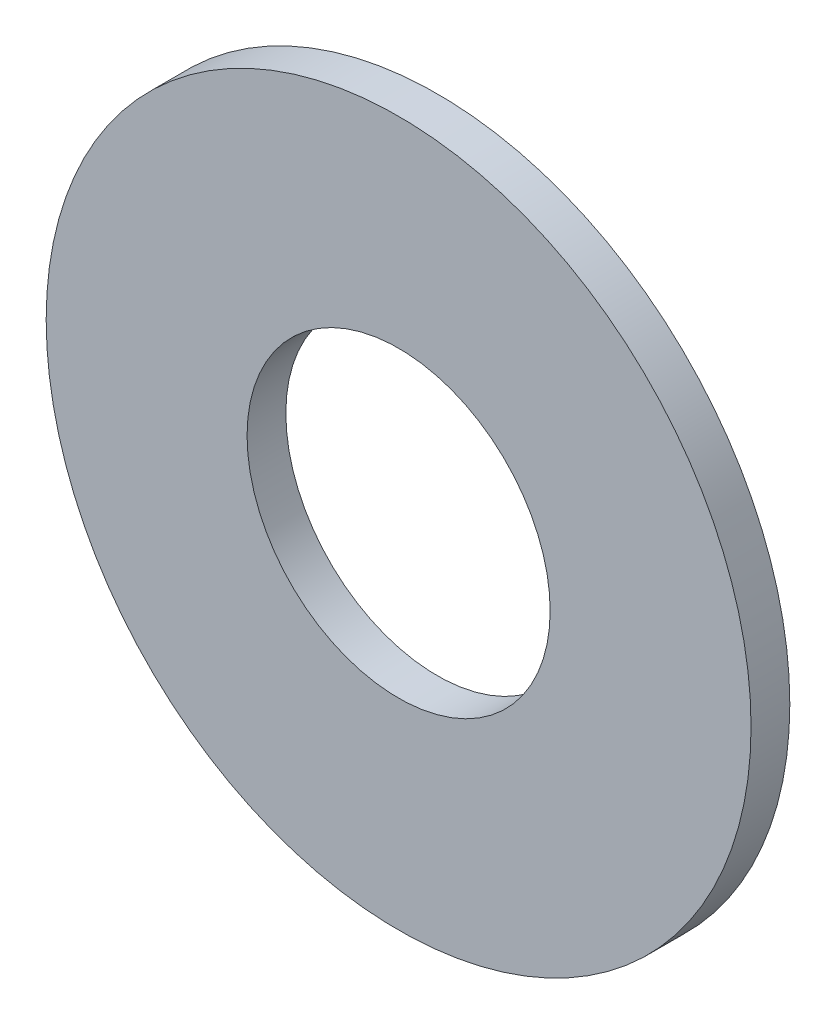
ISO-10303-21;
HEADER;
FILE_DESCRIPTION(('STEP AP214'),'2;1');
FILE_NAME('part.step','',(''),(''),'','','');
FILE_SCHEMA(('AUTOMOTIVE_DESIGN { 1 0 10303 214 1 1 1 1 }'));
ENDSEC;
DATA;
#1=APPLICATION_CONTEXT('core data for automotive mechanical design processes');
#2=APPLICATION_PROTOCOL_DEFINITION('international standard','automotive_design',2000,#1);
#3=PRODUCT_CONTEXT('',#1,'mechanical');
#4=PRODUCT('Part','Part','',(#3));
#5=PRODUCT_RELATED_PRODUCT_CATEGORY('part','',(#4));
#6=PRODUCT_DEFINITION_FORMATION('','',#4);
#7=PRODUCT_DEFINITION_CONTEXT('part definition',#1,'design');
#8=PRODUCT_DEFINITION('design','',#6,#7);
#9=PRODUCT_DEFINITION_SHAPE('','',#8);
#10=(LENGTH_UNIT() NAMED_UNIT(*) SI_UNIT(.MILLI.,.METRE.));
#11=(NAMED_UNIT(*) PLANE_ANGLE_UNIT() SI_UNIT($,.RADIAN.));
#12=(NAMED_UNIT(*) SI_UNIT($,.STERADIAN.) SOLID_ANGLE_UNIT());
#13=UNCERTAINTY_MEASURE_WITH_UNIT(LENGTH_MEASURE(1.E-05),#10,'distance_accuracy_value','');
#14=(GEOMETRIC_REPRESENTATION_CONTEXT(3) GLOBAL_UNCERTAINTY_ASSIGNED_CONTEXT((#13)) GLOBAL_UNIT_ASSIGNED_CONTEXT((#10,
#11,#12)) REPRESENTATION_CONTEXT('',''));
#15=CARTESIAN_POINT('',(0.,0.,0.));
#16=DIRECTION('',(0.,0.,1.));
#17=DIRECTION('',(1.,0.,0.));
#18=AXIS2_PLACEMENT_3D('',#15,#16,#17);
#19=CARTESIAN_POINT('',(0.,0.,1.397));
#20=DIRECTION('',(0.,0.,1.));
#21=DIRECTION('',(1.,0.,0.));
#22=AXIS2_PLACEMENT_3D('',#19,#20,#21);
#23=PLANE('',#22);
#24=CARTESIAN_POINT('',(0.,0.,1.397));
#25=DIRECTION('',(0.,0.,1.));
#26=DIRECTION('',(1.,0.,0.));
#27=AXIS2_PLACEMENT_3D('',#24,#25,#26);
#28=CIRCLE('',#27,12.7);
#29=CARTESIAN_POINT('',(12.7,0.,1.397));
#30=VERTEX_POINT('',#29);
#31=EDGE_CURVE('E10',#30,#30,#28,.T.);
#32=ORIENTED_EDGE('',*,*,#31,.T.);
#33=EDGE_LOOP('',(#32));
#34=FACE_BOUND('',#33,.T.);
#35=CARTESIAN_POINT('',(0.,0.,1.397));
#36=DIRECTION('',(0.,0.,1.));
#37=DIRECTION('',(1.,0.,0.));
#38=AXIS2_PLACEMENT_3D('',#35,#36,#37);
#39=CIRCLE('',#38,5.461);
#40=CARTESIAN_POINT('',(5.461,0.,1.397));
#41=VERTEX_POINT('',#40);
#42=EDGE_CURVE('E41',#41,#41,#39,.T.);
#43=ORIENTED_EDGE('',*,*,#42,.F.);
#44=EDGE_LOOP('',(#43));
#45=FACE_BOUND('',#44,.T.);
#46=ADVANCED_FACE('F30',(#34,#45),#23,.T.);
#47=CARTESIAN_POINT('',(0.,0.,0.));
#48=DIRECTION('',(0.,0.,1.));
#49=DIRECTION('',(1.,0.,0.));
#50=AXIS2_PLACEMENT_3D('',#47,#48,#49);
#51=PLANE('',#50);
#52=CARTESIAN_POINT('',(0.,0.,0.));
#53=DIRECTION('',(0.,0.,1.));
#54=DIRECTION('',(1.,0.,0.));
#55=AXIS2_PLACEMENT_3D('',#52,#53,#54);
#56=CIRCLE('',#55,12.7);
#57=CARTESIAN_POINT('',(12.7,0.,0.));
#58=VERTEX_POINT('',#57);
#59=EDGE_CURVE('E34',#58,#58,#56,.T.);
#60=ORIENTED_EDGE('',*,*,#59,.F.);
#61=EDGE_LOOP('',(#60));
#62=FACE_BOUND('',#61,.T.);
#63=CARTESIAN_POINT('',(0.,0.,0.));
#64=DIRECTION('',(0.,0.,1.));
#65=DIRECTION('',(1.,0.,0.));
#66=AXIS2_PLACEMENT_3D('',#63,#64,#65);
#67=CIRCLE('',#66,5.461);
#68=CARTESIAN_POINT('',(5.461,0.,0.));
#69=VERTEX_POINT('',#68);
#70=EDGE_CURVE('E43',#69,#69,#67,.T.);
#71=ORIENTED_EDGE('',*,*,#70,.T.);
#72=EDGE_LOOP('',(#71));
#73=FACE_BOUND('',#72,.T.);
#74=ADVANCED_FACE('F53',(#62,#73),#51,.F.);
#75=CARTESIAN_POINT('',(0.,0.,1.397));
#76=DIRECTION('',(0.,0.,-1.));
#77=DIRECTION('',(-1.,0.,0.));
#78=AXIS2_PLACEMENT_3D('',#75,#76,#77);
#79=CYLINDRICAL_SURFACE('',#78,12.7);
#80=ORIENTED_EDGE('',*,*,#31,.F.);
#81=EDGE_LOOP('',(#80));
#82=FACE_BOUND('',#81,.T.);
#83=ORIENTED_EDGE('',*,*,#59,.T.);
#84=EDGE_LOOP('',(#83));
#85=FACE_BOUND('',#84,.T.);
#86=ADVANCED_FACE('F32',(#82,#85),#79,.T.);
#87=CARTESIAN_POINT('',(0.,0.,1.397));
#88=DIRECTION('',(0.,0.,-1.));
#89=DIRECTION('',(-1.,0.,0.));
#90=AXIS2_PLACEMENT_3D('',#87,#88,#89);
#91=CYLINDRICAL_SURFACE('',#90,5.461);
#92=ORIENTED_EDGE('',*,*,#42,.T.);
#93=EDGE_LOOP('',(#92));
#94=FACE_BOUND('',#93,.T.);
#95=ORIENTED_EDGE('',*,*,#70,.F.);
#96=EDGE_LOOP('',(#95));
#97=FACE_BOUND('',#96,.T.);
#98=ADVANCED_FACE('F49',(#94,#97),#91,.F.);
#99=CLOSED_SHELL('',(#46,#74,#86,#98));
#100=MANIFOLD_SOLID_BREP('B2',#99);
#101=ADVANCED_BREP_SHAPE_REPRESENTATION('',(#18,#100),#14);
#102=SHAPE_DEFINITION_REPRESENTATION(#9,#101);
ENDSEC;
END-ISO-10303-21;
